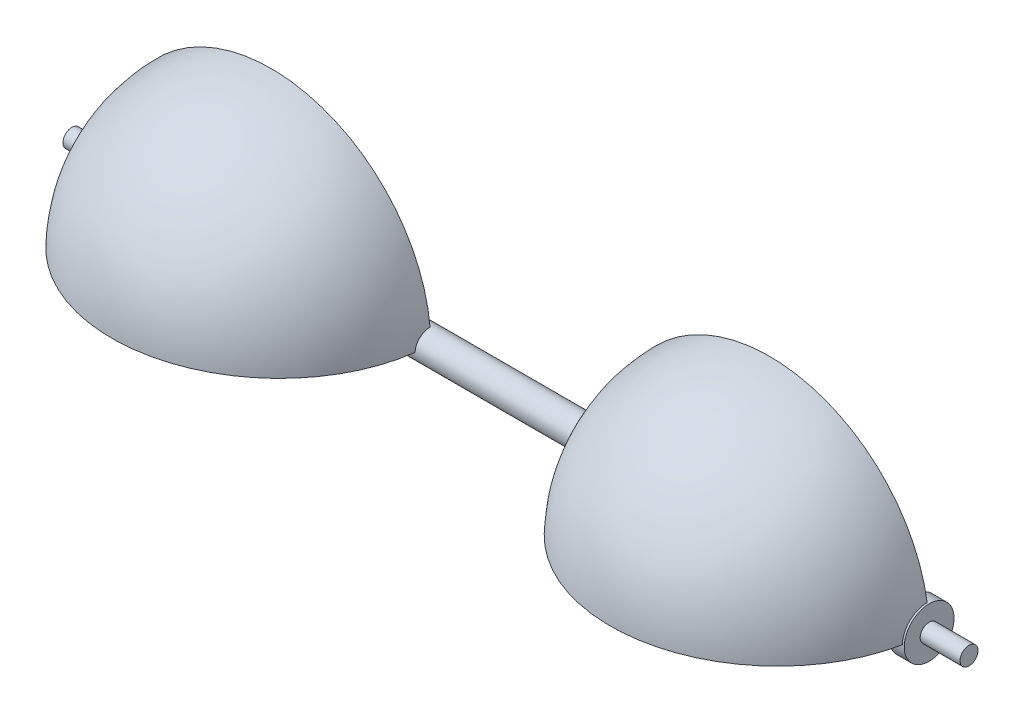
ISO-10303-21;
HEADER;
FILE_DESCRIPTION(('STEP AP214'),'2;1');
FILE_NAME('part.step','',(''),(''),'','','');
FILE_SCHEMA(('AUTOMOTIVE_DESIGN { 1 0 10303 214 1 1 1 1 }'));
ENDSEC;
DATA;
#1=APPLICATION_CONTEXT('core data for automotive mechanical design processes');
#2=APPLICATION_PROTOCOL_DEFINITION('international standard','automotive_design',2000,#1);
#3=PRODUCT_CONTEXT('',#1,'mechanical');
#4=PRODUCT('Part','Part','',(#3));
#5=PRODUCT_RELATED_PRODUCT_CATEGORY('part','',(#4));
#6=PRODUCT_DEFINITION_FORMATION('','',#4);
#7=PRODUCT_DEFINITION_CONTEXT('part definition',#1,'design');
#8=PRODUCT_DEFINITION('design','',#6,#7);
#9=PRODUCT_DEFINITION_SHAPE('','',#8);
#10=(LENGTH_UNIT() NAMED_UNIT(*) SI_UNIT(.MILLI.,.METRE.));
#11=(NAMED_UNIT(*) PLANE_ANGLE_UNIT() SI_UNIT($,.RADIAN.));
#12=(NAMED_UNIT(*) SI_UNIT($,.STERADIAN.) SOLID_ANGLE_UNIT());
#13=UNCERTAINTY_MEASURE_WITH_UNIT(LENGTH_MEASURE(1.E-05),#10,'distance_accuracy_value','');
#14=(GEOMETRIC_REPRESENTATION_CONTEXT(3) GLOBAL_UNCERTAINTY_ASSIGNED_CONTEXT((#13)) GLOBAL_UNIT_ASSIGNED_CONTEXT((#10,
#11,#12)) REPRESENTATION_CONTEXT('',''));
#15=CARTESIAN_POINT('',(0.,0.,0.));
#16=DIRECTION('',(0.,0.,1.));
#17=DIRECTION('',(1.,0.,0.));
#18=AXIS2_PLACEMENT_3D('',#15,#16,#17);
#19=CARTESIAN_POINT('',(-59.7969247492812,0.,0.));
#20=DIRECTION('',(1.,0.,0.));
#21=DIRECTION('',(0.,0.,-1.));
#22=AXIS2_PLACEMENT_3D('',#19,#20,#21);
#23=PLANE('',#22);
#24=CARTESIAN_POINT('',(-59.7969247492812,0.,0.));
#25=DIRECTION('',(1.,0.,0.));
#26=DIRECTION('',(0.,0.,-1.));
#27=AXIS2_PLACEMENT_3D('',#24,#25,#26);
#28=CIRCLE('',#27,2.5);
#29=CARTESIAN_POINT('',(-59.7969247492812,0.,-2.5));
#30=VERTEX_POINT('',#29);
#31=EDGE_CURVE('E344',#30,#30,#28,.T.);
#32=ORIENTED_EDGE('',*,*,#31,.F.);
#33=EDGE_LOOP('',(#32));
#34=FACE_BOUND('',#33,.T.);
#35=CARTESIAN_POINT('',(-59.7969247492812,0.,0.));
#36=DIRECTION('',(1.,0.,0.));
#37=DIRECTION('',(0.,0.,-1.));
#38=AXIS2_PLACEMENT_3D('',#35,#36,#37);
#39=CIRCLE('',#38,0.9);
#40=CARTESIAN_POINT('',(-59.7969247492812,0.,-0.9));
#41=VERTEX_POINT('',#40);
#42=EDGE_CURVE('E426',#41,#41,#39,.F.);
#43=ORIENTED_EDGE('',*,*,#42,.F.);
#44=EDGE_LOOP('',(#43));
#45=FACE_BOUND('',#44,.T.);
#46=ADVANCED_FACE('F33',(#34,#45),#23,.F.);
#47=CARTESIAN_POINT('',(22.2030752507188,0.,0.));
#48=DIRECTION('',(-1.,0.,0.));
#49=DIRECTION('',(0.,0.,1.));
#50=AXIS2_PLACEMENT_3D('',#47,#48,#49);
#51=PLANE('',#50);
#52=CARTESIAN_POINT('',(22.2030752507188,0.,0.));
#53=DIRECTION('',(1.,0.,0.));
#54=DIRECTION('',(0.,0.,-1.));
#55=AXIS2_PLACEMENT_3D('',#52,#53,#54);
#56=CIRCLE('',#55,2.5);
#57=CARTESIAN_POINT('',(22.2030752507188,0.,-2.5));
#58=VERTEX_POINT('',#57);
#59=EDGE_CURVE('E333',#58,#58,#56,.T.);
#60=ORIENTED_EDGE('',*,*,#59,.T.);
#61=EDGE_LOOP('',(#60));
#62=FACE_BOUND('',#61,.T.);
#63=CARTESIAN_POINT('',(22.2030752507188,0.,0.));
#64=DIRECTION('',(-1.,0.,0.));
#65=DIRECTION('',(0.,0.,1.));
#66=AXIS2_PLACEMENT_3D('',#63,#64,#65);
#67=CIRCLE('',#66,0.9);
#68=CARTESIAN_POINT('',(22.2030752507188,0.,0.9));
#69=VERTEX_POINT('',#68);
#70=EDGE_CURVE('E423',#69,#69,#67,.F.);
#71=ORIENTED_EDGE('',*,*,#70,.F.);
#72=EDGE_LOOP('',(#71));
#73=FACE_BOUND('',#72,.T.);
#74=ADVANCED_FACE('F485',(#62,#73),#51,.F.);
#75=CARTESIAN_POINT('',(6.20307525071882,0.,0.));
#76=DIRECTION('',(-1.,0.,0.));
#77=DIRECTION('',(0.,0.0348994967024975,0.999390827019096));
#78=AXIS2_PLACEMENT_3D('',#75,#76,#77);
#79=SPHERICAL_SURFACE('',#78,16.);
#80=CARTESIAN_POINT('',(22.0065558799979,0.,0.));
#81=DIRECTION('',(-1.,0.,0.));
#82=DIRECTION('',(0.,0.,1.));
#83=AXIS2_PLACEMENT_3D('',#80,#81,#82);
#84=CIRCLE('',#83,2.5);
#85=CARTESIAN_POINT('',(22.0065558799979,2.5,0.));
#86=VERTEX_POINT('',#85);
#87=CARTESIAN_POINT('',(22.0065558799979,0.0872487417562438,2.49847706754774));
#88=VERTEX_POINT('',#87);
#89=EDGE_CURVE('E338',#86,#88,#84,.F.);
#90=ORIENTED_EDGE('',*,*,#89,.F.);
#91=CARTESIAN_POINT('',(6.20307525071882,0.,0.));
#92=DIRECTION('',(0.,0.,1.));
#93=DIRECTION('',(1.,0.,0.));
#94=AXIS2_PLACEMENT_3D('',#91,#92,#93);
#95=CIRCLE('',#94,16.);
#96=CARTESIAN_POINT('',(-9.72645707135517,1.5,0.));
#97=VERTEX_POINT('',#96);
#98=EDGE_CURVE('E390',#86,#97,#95,.T.);
#99=ORIENTED_EDGE('',*,*,#98,.T.);
#100=CARTESIAN_POINT('',(-9.72645707135517,0.,0.));
#101=DIRECTION('',(1.,0.,0.));
#102=DIRECTION('',(0.,0.,-1.));
#103=AXIS2_PLACEMENT_3D('',#100,#101,#102);
#104=CIRCLE('',#103,1.5);
#105=CARTESIAN_POINT('',(-9.72645707135517,0.0523492450537463,1.49908624052864));
#106=VERTEX_POINT('',#105);
#107=EDGE_CURVE('E381',#106,#97,#104,.F.);
#108=ORIENTED_EDGE('',*,*,#107,.F.);
#109=CARTESIAN_POINT('',(6.20307525071882,0.,0.));
#110=DIRECTION('',(0.,-0.999390827019096,0.0348994967024975));
#111=DIRECTION('',(1.,0.,0.));
#112=AXIS2_PLACEMENT_3D('',#109,#110,#111);
#113=CIRCLE('',#112,16.);
#114=EDGE_CURVE('E392',#88,#106,#113,.T.);
#115=ORIENTED_EDGE('',*,*,#114,.F.);
#116=EDGE_LOOP('',(#90,#99,#108,#115));
#117=FACE_BOUND('',#116,.T.);
#118=ADVANCED_FACE('F35',(#117),#79,.T.);
#119=CARTESIAN_POINT('',(6.20307525071882,0.,0.));
#120=DIRECTION('',(0.,-0.999390827019096,0.0348994967024975));
#121=DIRECTION('',(1.,0.,0.));
#122=AXIS2_PLACEMENT_3D('',#119,#120,#121);
#123=PLANE('',#122);
#124=CARTESIAN_POINT('',(6.20307525071882,0.,0.));
#125=DIRECTION('',(0.,-0.999390827019096,0.0348994967024975));
#126=DIRECTION('',(0.,-0.0348994967024975,-0.999390827019096));
#127=AXIS2_PLACEMENT_3D('',#124,#125,#126);
#128=CIRCLE('',#127,15.);
#129=CARTESIAN_POINT('',(20.9932747084679,0.0872487417562438,2.49847706754774));
#130=VERTEX_POINT('',#129);
#131=CARTESIAN_POINT('',(-8.72173630588048,0.0523492450537463,1.49908624052864));
#132=VERTEX_POINT('',#131);
#133=EDGE_CURVE('E301',#130,#132,#128,.T.);
#134=ORIENTED_EDGE('',*,*,#133,.F.);
#135=DIRECTION('',(1.,0.,0.));
#136=VECTOR('',#135,1.);
#137=CARTESIAN_POINT('',(-8.29692474928118,0.0872487417562438,2.49847706754774));
#138=LINE('',#137,#136);
#139=EDGE_CURVE('E341',#130,#88,#138,.T.);
#140=ORIENTED_EDGE('',*,*,#139,.T.);
#141=ORIENTED_EDGE('',*,*,#114,.T.);
#142=DIRECTION('',(1.,0.,0.));
#143=VECTOR('',#142,1.);
#144=CARTESIAN_POINT('',(-8.29692474928118,0.0523492450537463,1.49908624052864));
#145=LINE('',#144,#143);
#146=EDGE_CURVE('E385',#106,#132,#145,.T.);
#147=ORIENTED_EDGE('',*,*,#146,.T.);
#148=EDGE_LOOP('',(#134,#140,#141,#147));
#149=FACE_BOUND('',#148,.T.);
#150=ADVANCED_FACE('F522',(#149),#123,.T.);
#151=CARTESIAN_POINT('',(6.20307525071882,0.,0.));
#152=DIRECTION('',(0.,0.,1.));
#153=DIRECTION('',(1.,0.,0.));
#154=AXIS2_PLACEMENT_3D('',#151,#152,#153);
#155=PLANE('',#154);
#156=DIRECTION('',(1.,0.,0.));
#157=VECTOR('',#156,1.);
#158=CARTESIAN_POINT('',(-8.29692474928118,2.5,0.));
#159=LINE('',#158,#157);
#160=CARTESIAN_POINT('',(20.9932747084679,2.5,0.));
#161=VERTEX_POINT('',#160);
#162=EDGE_CURVE('E419',#161,#86,#159,.T.);
#163=ORIENTED_EDGE('',*,*,#162,.F.);
#164=CARTESIAN_POINT('',(6.20307525071882,0.,0.));
#165=DIRECTION('',(0.,0.,1.));
#166=DIRECTION('',(1.,0.,0.));
#167=AXIS2_PLACEMENT_3D('',#164,#165,#166);
#168=CIRCLE('',#167,15.);
#169=CARTESIAN_POINT('',(-8.72173630588048,1.5,0.));
#170=VERTEX_POINT('',#169);
#171=EDGE_CURVE('E293',#161,#170,#168,.T.);
#172=ORIENTED_EDGE('',*,*,#171,.T.);
#173=DIRECTION('',(1.,0.,0.));
#174=VECTOR('',#173,1.);
#175=CARTESIAN_POINT('',(-8.29692474928118,1.5,0.));
#176=LINE('',#175,#174);
#177=EDGE_CURVE('E395',#97,#170,#176,.T.);
#178=ORIENTED_EDGE('',*,*,#177,.F.);
#179=ORIENTED_EDGE('',*,*,#98,.F.);
#180=EDGE_LOOP('',(#163,#172,#178,#179));
#181=FACE_BOUND('',#180,.T.);
#182=ADVANCED_FACE('F510',(#181),#155,.F.);
#183=CARTESIAN_POINT('',(-43.7969247492812,0.,0.));
#184=DIRECTION('',(-1.,0.,0.));
#185=DIRECTION('',(0.,0.0348994967024975,0.999390827019096));
#186=AXIS2_PLACEMENT_3D('',#183,#184,#185);
#187=SPHERICAL_SURFACE('',#186,16.);
#188=CARTESIAN_POINT('',(-59.6004053785603,0.,0.));
#189=DIRECTION('',(1.,0.,0.));
#190=DIRECTION('',(0.,0.,-1.));
#191=AXIS2_PLACEMENT_3D('',#188,#189,#190);
#192=CIRCLE('',#191,2.5);
#193=CARTESIAN_POINT('',(-59.6004053785603,0.0872487417562438,2.49847706754774));
#194=VERTEX_POINT('',#193);
#195=CARTESIAN_POINT('',(-59.6004053785603,2.5,0.));
#196=VERTEX_POINT('',#195);
#197=EDGE_CURVE('E351',#194,#196,#192,.F.);
#198=ORIENTED_EDGE('',*,*,#197,.F.);
#199=CARTESIAN_POINT('',(-43.7969247492812,0.,0.));
#200=DIRECTION('',(0.,-0.999390827019096,0.0348994967024975));
#201=DIRECTION('',(1.,0.,0.));
#202=AXIS2_PLACEMENT_3D('',#199,#200,#201);
#203=CIRCLE('',#202,16.);
#204=CARTESIAN_POINT('',(-27.8673924272072,0.0523492450537461,1.49908624052864));
#205=VERTEX_POINT('',#204);
#206=EDGE_CURVE('E364',#205,#194,#203,.T.);
#207=ORIENTED_EDGE('',*,*,#206,.F.);
#208=CARTESIAN_POINT('',(-27.8673924272072,0.,0.));
#209=DIRECTION('',(-1.,0.,0.));
#210=DIRECTION('',(0.,0.,1.));
#211=AXIS2_PLACEMENT_3D('',#208,#209,#210);
#212=CIRCLE('',#211,1.5);
#213=CARTESIAN_POINT('',(-27.8673924272072,1.5,0.));
#214=VERTEX_POINT('',#213);
#215=EDGE_CURVE('E406',#205,#214,#212,.T.);
#216=ORIENTED_EDGE('',*,*,#215,.T.);
#217=CARTESIAN_POINT('',(-43.7969247492812,0.,0.));
#218=DIRECTION('',(0.,0.,1.));
#219=DIRECTION('',(1.,0.,0.));
#220=AXIS2_PLACEMENT_3D('',#217,#218,#219);
#221=CIRCLE('',#220,16.);
#222=EDGE_CURVE('E361',#214,#196,#221,.T.);
#223=ORIENTED_EDGE('',*,*,#222,.T.);
#224=EDGE_LOOP('',(#198,#207,#216,#223));
#225=FACE_BOUND('',#224,.T.);
#226=ADVANCED_FACE('F452',(#225),#187,.T.);
#227=CARTESIAN_POINT('',(-43.7969247492812,0.,0.));
#228=DIRECTION('',(0.,-0.999390827019096,0.0348994967024975));
#229=DIRECTION('',(1.,0.,0.));
#230=AXIS2_PLACEMENT_3D('',#227,#228,#229);
#231=PLANE('',#230);
#232=CARTESIAN_POINT('',(-43.7969247492812,0.,0.));
#233=DIRECTION('',(0.,-0.999390827019096,0.0348994967024975));
#234=DIRECTION('',(0.,-0.0348994967024975,-0.999390827019096));
#235=AXIS2_PLACEMENT_3D('',#232,#233,#234);
#236=CIRCLE('',#235,15.);
#237=CARTESIAN_POINT('',(-28.8721131926819,0.0523492450537463,1.49908624052864));
#238=VERTEX_POINT('',#237);
#239=CARTESIAN_POINT('',(-58.5871242070302,0.0872487417562439,2.49847706754774));
#240=VERTEX_POINT('',#239);
#241=EDGE_CURVE('E315',#238,#240,#236,.T.);
#242=ORIENTED_EDGE('',*,*,#241,.F.);
#243=DIRECTION('',(1.,0.,0.));
#244=VECTOR('',#243,1.);
#245=CARTESIAN_POINT('',(-8.29692474928118,0.0523492450537463,1.49908624052864));
#246=LINE('',#245,#244);
#247=EDGE_CURVE('E372',#205,#238,#246,.F.);
#248=ORIENTED_EDGE('',*,*,#247,.F.);
#249=ORIENTED_EDGE('',*,*,#206,.T.);
#250=DIRECTION('',(1.,0.,0.));
#251=VECTOR('',#250,1.);
#252=CARTESIAN_POINT('',(-8.29692474928118,0.0872487417562438,2.49847706754774));
#253=LINE('',#252,#251);
#254=EDGE_CURVE('E355',#194,#240,#253,.T.);
#255=ORIENTED_EDGE('',*,*,#254,.T.);
#256=EDGE_LOOP('',(#242,#248,#249,#255));
#257=FACE_BOUND('',#256,.T.);
#258=ADVANCED_FACE('F448',(#257),#231,.T.);
#259=CARTESIAN_POINT('',(-43.7969247492812,0.,0.));
#260=DIRECTION('',(0.,0.,1.));
#261=DIRECTION('',(1.,0.,0.));
#262=AXIS2_PLACEMENT_3D('',#259,#260,#261);
#263=PLANE('',#262);
#264=DIRECTION('',(1.,0.,0.));
#265=VECTOR('',#264,1.);
#266=CARTESIAN_POINT('',(-8.29692474928118,1.5,0.));
#267=LINE('',#266,#265);
#268=CARTESIAN_POINT('',(-28.8721131926819,1.5,0.));
#269=VERTEX_POINT('',#268);
#270=EDGE_CURVE('E368',#214,#269,#267,.F.);
#271=ORIENTED_EDGE('',*,*,#270,.T.);
#272=CARTESIAN_POINT('',(-43.7969247492812,0.,0.));
#273=DIRECTION('',(0.,0.,1.));
#274=DIRECTION('',(1.,0.,0.));
#275=AXIS2_PLACEMENT_3D('',#272,#273,#274);
#276=CIRCLE('',#275,15.);
#277=CARTESIAN_POINT('',(-58.5871242070302,2.5,0.));
#278=VERTEX_POINT('',#277);
#279=EDGE_CURVE('E319',#269,#278,#276,.T.);
#280=ORIENTED_EDGE('',*,*,#279,.T.);
#281=DIRECTION('',(1.,0.,0.));
#282=VECTOR('',#281,1.);
#283=CARTESIAN_POINT('',(-8.29692474928118,2.5,0.));
#284=LINE('',#283,#282);
#285=EDGE_CURVE('E410',#196,#278,#284,.T.);
#286=ORIENTED_EDGE('',*,*,#285,.F.);
#287=ORIENTED_EDGE('',*,*,#222,.F.);
#288=EDGE_LOOP('',(#271,#280,#286,#287));
#289=FACE_BOUND('',#288,.T.);
#290=ADVANCED_FACE('F458',(#289),#263,.F.);
#291=CARTESIAN_POINT('',(-8.29692474928118,0.,0.));
#292=DIRECTION('',(-1.,0.,0.));
#293=DIRECTION('',(0.,0.,1.));
#294=AXIS2_PLACEMENT_3D('',#291,#292,#293);
#295=PLANE('',#294);
#296=DIRECTION('',(0.,-0.0348994967024975,-0.999390827019096));
#297=VECTOR('',#296,1.);
#298=CARTESIAN_POINT('',(-8.29692474928118,0.,0.));
#299=LINE('',#298,#297);
#300=CARTESIAN_POINT('',(-8.29692474928118,0.0523492450537463,1.49908624052864));
#301=VERTEX_POINT('',#300);
#302=CARTESIAN_POINT('',(-8.29692474928118,0.,0.));
#303=VERTEX_POINT('',#302);
#304=EDGE_CURVE('E388',#301,#303,#299,.T.);
#305=ORIENTED_EDGE('',*,*,#304,.F.);
#306=CARTESIAN_POINT('',(-8.29692474928118,0.,0.));
#307=DIRECTION('',(1.,0.,0.));
#308=DIRECTION('',(0.,0.,-1.));
#309=AXIS2_PLACEMENT_3D('',#306,#307,#308);
#310=CIRCLE('',#309,1.5);
#311=CARTESIAN_POINT('',(-8.29692474928118,1.5,0.));
#312=VERTEX_POINT('',#311);
#313=EDGE_CURVE('E378',#301,#312,#310,.T.);
#314=ORIENTED_EDGE('',*,*,#313,.T.);
#315=DIRECTION('',(0.,-1.,0.));
#316=VECTOR('',#315,1.);
#317=CARTESIAN_POINT('',(-8.29692474928118,0.,0.));
#318=LINE('',#317,#316);
#319=EDGE_CURVE('E398',#312,#303,#318,.T.);
#320=ORIENTED_EDGE('',*,*,#319,.T.);
#321=EDGE_LOOP('',(#305,#314,#320));
#322=FACE_BOUND('',#321,.T.);
#323=ADVANCED_FACE('F505',(#322),#295,.F.);
#324=CARTESIAN_POINT('',(-8.29692474928118,0.,0.));
#325=DIRECTION('',(1.,0.,0.));
#326=DIRECTION('',(0.,0.,-1.));
#327=AXIS2_PLACEMENT_3D('',#324,#325,#326);
#328=CYLINDRICAL_SURFACE('',#327,1.5);
#329=ORIENTED_EDGE('',*,*,#146,.F.);
#330=ORIENTED_EDGE('',*,*,#107,.T.);
#331=ORIENTED_EDGE('',*,*,#177,.T.);
#332=EDGE_CURVE('E394',#170,#312,#176,.T.);
#333=ORIENTED_EDGE('',*,*,#332,.T.);
#334=ORIENTED_EDGE('',*,*,#313,.F.);
#335=EDGE_CURVE('E384',#132,#301,#145,.T.);
#336=ORIENTED_EDGE('',*,*,#335,.F.);
#337=EDGE_LOOP('',(#329,#330,#331,#333,#334,#336));
#338=FACE_BOUND('',#337,.T.);
#339=ORIENTED_EDGE('',*,*,#215,.F.);
#340=ORIENTED_EDGE('',*,*,#247,.T.);
#341=CARTESIAN_POINT('',(-29.2969247492812,0.0523492450537463,1.49908624052864));
#342=VERTEX_POINT('',#341);
#343=EDGE_CURVE('E371',#238,#342,#246,.F.);
#344=ORIENTED_EDGE('',*,*,#343,.T.);
#345=CARTESIAN_POINT('',(-29.2969247492812,0.,0.));
#346=DIRECTION('',(1.,0.,0.));
#347=DIRECTION('',(0.,0.,-1.));
#348=AXIS2_PLACEMENT_3D('',#345,#346,#347);
#349=CIRCLE('',#348,1.5);
#350=CARTESIAN_POINT('',(-29.2969247492812,1.5,0.));
#351=VERTEX_POINT('',#350);
#352=EDGE_CURVE('E375',#342,#351,#349,.T.);
#353=ORIENTED_EDGE('',*,*,#352,.T.);
#354=EDGE_CURVE('E367',#269,#351,#267,.F.);
#355=ORIENTED_EDGE('',*,*,#354,.F.);
#356=ORIENTED_EDGE('',*,*,#270,.F.);
#357=EDGE_LOOP('',(#339,#340,#344,#353,#355,#356));
#358=FACE_BOUND('',#357,.T.);
#359=ADVANCED_FACE('F513',(#338,#358),#328,.T.);
#360=CARTESIAN_POINT('',(-29.2969247492812,0.,0.));
#361=DIRECTION('',(1.,0.,0.));
#362=DIRECTION('',(0.,0.,-1.));
#363=AXIS2_PLACEMENT_3D('',#360,#361,#362);
#364=PLANE('',#363);
#365=ORIENTED_EDGE('',*,*,#352,.F.);
#366=DIRECTION('',(0.,-0.0348994967024975,-0.999390827019096));
#367=VECTOR('',#366,1.);
#368=CARTESIAN_POINT('',(-29.2969247492812,0.,0.));
#369=LINE('',#368,#367);
#370=CARTESIAN_POINT('',(-29.2969247492812,0.,0.));
#371=VERTEX_POINT('',#370);
#372=EDGE_CURVE('E403',#342,#371,#369,.T.);
#373=ORIENTED_EDGE('',*,*,#372,.T.);
#374=DIRECTION('',(0.,-1.,0.));
#375=VECTOR('',#374,1.);
#376=CARTESIAN_POINT('',(-29.2969247492812,0.,0.));
#377=LINE('',#376,#375);
#378=EDGE_CURVE('E401',#351,#371,#377,.T.);
#379=ORIENTED_EDGE('',*,*,#378,.F.);
#380=EDGE_LOOP('',(#365,#373,#379));
#381=FACE_BOUND('',#380,.T.);
#382=ADVANCED_FACE('F502',(#381),#364,.F.);
#383=CARTESIAN_POINT('',(-58.2969247492812,0.,0.));
#384=DIRECTION('',(-1.,0.,0.));
#385=DIRECTION('',(0.,0.,1.));
#386=AXIS2_PLACEMENT_3D('',#383,#384,#385);
#387=PLANE('',#386);
#388=CARTESIAN_POINT('',(-58.2969247492812,0.,0.));
#389=DIRECTION('',(1.,0.,0.));
#390=DIRECTION('',(0.,0.,-1.));
#391=AXIS2_PLACEMENT_3D('',#388,#389,#390);
#392=CIRCLE('',#391,2.);
#393=CARTESIAN_POINT('',(-58.2969247492812,2.,0.));
#394=VERTEX_POINT('',#393);
#395=CARTESIAN_POINT('',(-58.2969247492812,0.0697989934049951,1.99878165403819));
#396=VERTEX_POINT('',#395);
#397=EDGE_CURVE('E238',#394,#396,#392,.T.);
#398=ORIENTED_EDGE('',*,*,#397,.T.);
#399=DIRECTION('',(0.,-0.0348994967024975,-0.999390827019096));
#400=VECTOR('',#399,1.);
#401=CARTESIAN_POINT('',(-58.2969247492812,0.,0.));
#402=LINE('',#401,#400);
#403=CARTESIAN_POINT('',(-58.2969247492812,0.0872487417562438,2.49847706754774));
#404=VERTEX_POINT('',#403);
#405=EDGE_CURVE('E358',#404,#396,#402,.T.);
#406=ORIENTED_EDGE('',*,*,#405,.F.);
#407=CARTESIAN_POINT('',(-58.2969247492812,0.,0.));
#408=DIRECTION('',(1.,0.,0.));
#409=DIRECTION('',(0.,0.,-1.));
#410=AXIS2_PLACEMENT_3D('',#407,#408,#409);
#411=CIRCLE('',#410,2.5);
#412=CARTESIAN_POINT('',(-58.2969247492812,-1.5,2.));
#413=VERTEX_POINT('',#412);
#414=EDGE_CURVE('E348',#404,#413,#411,.T.);
#415=ORIENTED_EDGE('',*,*,#414,.T.);
#416=DIRECTION('',(0.,-1.,0.));
#417=VECTOR('',#416,1.);
#418=CARTESIAN_POINT('',(-58.2969247492812,0.,2.));
#419=LINE('',#418,#417);
#420=CARTESIAN_POINT('',(-58.2969247492812,-9.,2.));
#421=VERTEX_POINT('',#420);
#422=EDGE_CURVE('E241',#413,#421,#419,.T.);
#423=ORIENTED_EDGE('',*,*,#422,.T.);
#424=CARTESIAN_POINT('',(-58.2969247492812,-9.,0.));
#425=DIRECTION('',(1.,0.,0.));
#426=DIRECTION('',(0.,0.,-1.));
#427=AXIS2_PLACEMENT_3D('',#424,#425,#426);
#428=CIRCLE('',#427,2.);
#429=CARTESIAN_POINT('',(-58.2969247492812,-9.,-2.));
#430=VERTEX_POINT('',#429);
#431=EDGE_CURVE('E228',#421,#430,#428,.T.);
#432=ORIENTED_EDGE('',*,*,#431,.T.);
#433=DIRECTION('',(0.,1.,0.));
#434=VECTOR('',#433,1.);
#435=CARTESIAN_POINT('',(-58.2969247492812,0.,-2.));
#436=LINE('',#435,#434);
#437=CARTESIAN_POINT('',(-58.2969247492812,-1.5,-2.));
#438=VERTEX_POINT('',#437);
#439=EDGE_CURVE('E48',#430,#438,#436,.T.);
#440=ORIENTED_EDGE('',*,*,#439,.T.);
#441=CARTESIAN_POINT('',(-58.2969247492812,2.5,0.));
#442=VERTEX_POINT('',#441);
#443=EDGE_CURVE('E347',#438,#442,#411,.T.);
#444=ORIENTED_EDGE('',*,*,#443,.T.);
#445=DIRECTION('',(0.,-1.,0.));
#446=VECTOR('',#445,1.);
#447=CARTESIAN_POINT('',(-58.2969247492812,0.,0.));
#448=LINE('',#447,#446);
#449=EDGE_CURVE('E413',#442,#394,#448,.T.);
#450=ORIENTED_EDGE('',*,*,#449,.T.);
#451=EDGE_LOOP('',(#398,#406,#415,#423,#432,#440,#444,#450));
#452=FACE_BOUND('',#451,.T.);
#453=CARTESIAN_POINT('',(-58.2969247492812,-9.,0.));
#454=DIRECTION('',(1.,0.,0.));
#455=DIRECTION('',(0.,0.,-1.));
#456=AXIS2_PLACEMENT_3D('',#453,#454,#455);
#457=CIRCLE('',#456,0.75);
#458=CARTESIAN_POINT('',(-58.2969247492812,-9.,-0.750000000000002));
#459=VERTEX_POINT('',#458);
#460=EDGE_CURVE('E813',#459,#459,#457,.T.);
#461=ORIENTED_EDGE('',*,*,#460,.F.);
#462=EDGE_LOOP('',(#461));
#463=FACE_BOUND('',#462,.T.);
#464=ADVANCED_FACE('F439',(#452,#463),#387,.F.);
#465=CARTESIAN_POINT('',(-8.29692474928118,0.,0.));
#466=DIRECTION('',(1.,0.,0.));
#467=DIRECTION('',(0.,0.,-1.));
#468=AXIS2_PLACEMENT_3D('',#465,#466,#467);
#469=CYLINDRICAL_SURFACE('',#468,2.5);
#470=ORIENTED_EDGE('',*,*,#443,.F.);
#471=DIRECTION('',(1.,0.,0.));
#472=VECTOR('',#471,1.);
#473=CARTESIAN_POINT('',(-8.29692474928118,-1.5,-2.));
#474=LINE('',#473,#472);
#475=CARTESIAN_POINT('',(-59.2969247492812,-1.5,-2.));
#476=VERTEX_POINT('',#475);
#477=EDGE_CURVE('E11',#438,#476,#474,.F.);
#478=ORIENTED_EDGE('',*,*,#477,.T.);
#479=CARTESIAN_POINT('',(-59.2969247492812,0.,0.));
#480=DIRECTION('',(1.,0.,0.));
#481=DIRECTION('',(0.,0.,-1.));
#482=AXIS2_PLACEMENT_3D('',#479,#480,#481);
#483=CIRCLE('',#482,2.5);
#484=CARTESIAN_POINT('',(-59.2969247492812,-1.5,2.));
#485=VERTEX_POINT('',#484);
#486=EDGE_CURVE('E431',#485,#476,#483,.T.);
#487=ORIENTED_EDGE('',*,*,#486,.F.);
#488=DIRECTION('',(1.,0.,0.));
#489=VECTOR('',#488,1.);
#490=CARTESIAN_POINT('',(-8.29692474928118,-1.5,2.));
#491=LINE('',#490,#489);
#492=EDGE_CURVE('E41',#485,#413,#491,.T.);
#493=ORIENTED_EDGE('',*,*,#492,.T.);
#494=ORIENTED_EDGE('',*,*,#414,.F.);
#495=EDGE_CURVE('E354',#240,#404,#253,.T.);
#496=ORIENTED_EDGE('',*,*,#495,.F.);
#497=ORIENTED_EDGE('',*,*,#254,.F.);
#498=ORIENTED_EDGE('',*,*,#197,.T.);
#499=ORIENTED_EDGE('',*,*,#285,.T.);
#500=EDGE_CURVE('E409',#278,#442,#284,.T.);
#501=ORIENTED_EDGE('',*,*,#500,.T.);
#502=EDGE_LOOP('',(#470,#478,#487,#493,#494,#496,#497,#498,#499,#501));
#503=FACE_BOUND('',#502,.T.);
#504=ORIENTED_EDGE('',*,*,#31,.T.);
#505=EDGE_LOOP('',(#504));
#506=FACE_BOUND('',#505,.T.);
#507=ADVANCED_FACE('F435',(#503,#506),#469,.T.);
#508=CARTESIAN_POINT('',(-8.29692474928118,0.,0.));
#509=DIRECTION('',(1.,0.,0.));
#510=DIRECTION('',(0.,0.,-1.));
#511=AXIS2_PLACEMENT_3D('',#508,#509,#510);
#512=CYLINDRICAL_SURFACE('',#511,2.5);
#513=CARTESIAN_POINT('',(20.7030752507188,0.0872487417562438,2.49847706754774));
#514=VERTEX_POINT('',#513);
#515=EDGE_CURVE('E342',#514,#130,#138,.T.);
#516=ORIENTED_EDGE('',*,*,#515,.F.);
#517=CARTESIAN_POINT('',(20.7030752507188,0.,0.));
#518=DIRECTION('',(1.,0.,0.));
#519=DIRECTION('',(0.,0.,-1.));
#520=AXIS2_PLACEMENT_3D('',#517,#518,#519);
#521=CIRCLE('',#520,2.5);
#522=CARTESIAN_POINT('',(20.7030752507188,2.5,0.));
#523=VERTEX_POINT('',#522);
#524=EDGE_CURVE('E330',#514,#523,#521,.T.);
#525=ORIENTED_EDGE('',*,*,#524,.T.);
#526=EDGE_CURVE('E420',#523,#161,#159,.T.);
#527=ORIENTED_EDGE('',*,*,#526,.T.);
#528=ORIENTED_EDGE('',*,*,#162,.T.);
#529=ORIENTED_EDGE('',*,*,#89,.T.);
#530=ORIENTED_EDGE('',*,*,#139,.F.);
#531=EDGE_LOOP('',(#516,#525,#527,#528,#529,#530));
#532=FACE_BOUND('',#531,.T.);
#533=ORIENTED_EDGE('',*,*,#59,.F.);
#534=EDGE_LOOP('',(#533));
#535=FACE_BOUND('',#534,.T.);
#536=ADVANCED_FACE('F499',(#532,#535),#512,.T.);
#537=CARTESIAN_POINT('',(20.7030752507188,0.,0.));
#538=DIRECTION('',(1.,0.,0.));
#539=DIRECTION('',(0.,0.,-1.));
#540=AXIS2_PLACEMENT_3D('',#537,#538,#539);
#541=PLANE('',#540);
#542=DIRECTION('',(0.,0.0348994967024975,0.999390827019096));
#543=VECTOR('',#542,1.);
#544=CARTESIAN_POINT('',(20.7030752507188,0.,0.));
#545=LINE('',#544,#543);
#546=CARTESIAN_POINT('',(20.7030752507188,0.,0.));
#547=VERTEX_POINT('',#546);
#548=EDGE_CURVE('E336',#547,#514,#545,.T.);
#549=ORIENTED_EDGE('',*,*,#548,.F.);
#550=DIRECTION('',(0.,1.,0.));
#551=VECTOR('',#550,1.);
#552=CARTESIAN_POINT('',(20.7030752507188,0.,0.));
#553=LINE('',#552,#551);
#554=EDGE_CURVE('E416',#547,#523,#553,.T.);
#555=ORIENTED_EDGE('',*,*,#554,.T.);
#556=ORIENTED_EDGE('',*,*,#524,.F.);
#557=EDGE_LOOP('',(#549,#555,#556));
#558=FACE_BOUND('',#557,.T.);
#559=ADVANCED_FACE('F601',(#558),#541,.F.);
#560=CARTESIAN_POINT('',(6.20307525071882,0.,0.));
#561=DIRECTION('',(0.,-0.999390827019096,0.0348994967024975));
#562=DIRECTION('',(1.,0.,0.));
#563=AXIS2_PLACEMENT_3D('',#560,#561,#562);
#564=PLANE('',#563);
#565=ORIENTED_EDGE('',*,*,#548,.T.);
#566=ORIENTED_EDGE('',*,*,#515,.T.);
#567=CARTESIAN_POINT('',(21.1278868073181,0.0523492450537463,1.49908624052864));
#568=VERTEX_POINT('',#567);
#569=EDGE_CURVE('E298',#568,#130,#128,.T.);
#570=ORIENTED_EDGE('',*,*,#569,.F.);
#571=DIRECTION('',(1.,0.,0.));
#572=VECTOR('',#571,1.);
#573=CARTESIAN_POINT('',(21.7030752507188,0.0523492450537463,1.49908624052864));
#574=LINE('',#573,#572);
#575=CARTESIAN_POINT('',(21.2030752507188,0.0523492450537463,1.49908624052864));
#576=VERTEX_POINT('',#575);
#577=EDGE_CURVE('E271',#576,#568,#574,.F.);
#578=ORIENTED_EDGE('',*,*,#577,.F.);
#579=DIRECTION('',(0.,0.0348994967024975,0.999390827019096));
#580=VECTOR('',#579,1.);
#581=CARTESIAN_POINT('',(21.2030752507188,0.,0.));
#582=LINE('',#581,#580);
#583=CARTESIAN_POINT('',(21.2030752507188,0.,0.));
#584=VERTEX_POINT('',#583);
#585=EDGE_CURVE('E295',#584,#576,#582,.T.);
#586=ORIENTED_EDGE('',*,*,#585,.F.);
#587=DIRECTION('',(1.,0.,0.));
#588=VECTOR('',#587,1.);
#589=CARTESIAN_POINT('',(-9.79692474928118,0.,0.));
#590=LINE('',#589,#588);
#591=EDGE_CURVE('E267',#547,#584,#590,.T.);
#592=ORIENTED_EDGE('',*,*,#591,.F.);
#593=EDGE_LOOP('',(#565,#566,#570,#578,#586,#592));
#594=FACE_BOUND('',#593,.T.);
#595=ADVANCED_FACE('F576',(#594),#564,.F.);
#596=CARTESIAN_POINT('',(6.20307525071882,0.,0.));
#597=DIRECTION('',(0.,0.,1.));
#598=DIRECTION('',(1.,0.,0.));
#599=AXIS2_PLACEMENT_3D('',#596,#597,#598);
#600=PLANE('',#599);
#601=ORIENTED_EDGE('',*,*,#554,.F.);
#602=ORIENTED_EDGE('',*,*,#591,.T.);
#603=DIRECTION('',(0.,-1.,0.));
#604=VECTOR('',#603,1.);
#605=CARTESIAN_POINT('',(21.2030752507188,0.,0.));
#606=LINE('',#605,#604);
#607=CARTESIAN_POINT('',(21.2030752507188,1.5,0.));
#608=VERTEX_POINT('',#607);
#609=EDGE_CURVE('E327',#608,#584,#606,.T.);
#610=ORIENTED_EDGE('',*,*,#609,.F.);
#611=DIRECTION('',(1.,0.,0.));
#612=VECTOR('',#611,1.);
#613=CARTESIAN_POINT('',(21.7030752507188,1.5,0.));
#614=LINE('',#613,#612);
#615=CARTESIAN_POINT('',(21.1278868073181,1.5,0.));
#616=VERTEX_POINT('',#615);
#617=EDGE_CURVE('E282',#608,#616,#614,.F.);
#618=ORIENTED_EDGE('',*,*,#617,.T.);
#619=EDGE_CURVE('E289',#616,#161,#168,.T.);
#620=ORIENTED_EDGE('',*,*,#619,.T.);
#621=ORIENTED_EDGE('',*,*,#526,.F.);
#622=EDGE_LOOP('',(#601,#602,#610,#618,#620,#621));
#623=FACE_BOUND('',#622,.T.);
#624=ADVANCED_FACE('F620',(#623),#600,.T.);
#625=CARTESIAN_POINT('',(-43.7969247492812,0.,0.));
#626=DIRECTION('',(0.,-0.999390827019096,0.0348994967024975));
#627=DIRECTION('',(1.,0.,0.));
#628=AXIS2_PLACEMENT_3D('',#625,#626,#627);
#629=PLANE('',#628);
#630=ORIENTED_EDGE('',*,*,#343,.F.);
#631=CARTESIAN_POINT('',(-28.8052603987162,0.0174497483512488,0.499695413509548));
#632=VERTEX_POINT('',#631);
#633=EDGE_CURVE('E262',#632,#238,#236,.T.);
#634=ORIENTED_EDGE('',*,*,#633,.F.);
#635=DIRECTION('',(1.,0.,0.));
#636=VECTOR('',#635,1.);
#637=CARTESIAN_POINT('',(-28.8052603987162,0.0174497483512488,0.499695413509548));
#638=LINE('',#637,#636);
#639=CARTESIAN_POINT('',(-28.2969247492812,0.0174497483512488,0.499695413509548));
#640=VERTEX_POINT('',#639);
#641=EDGE_CURVE('E286',#632,#640,#638,.T.);
#642=ORIENTED_EDGE('',*,*,#641,.T.);
#643=DIRECTION('',(0.,-0.0348994967024975,-0.999390827019096));
#644=VECTOR('',#643,1.);
#645=CARTESIAN_POINT('',(-28.2969247492812,0.,0.));
#646=LINE('',#645,#644);
#647=CARTESIAN_POINT('',(-28.2969247492812,0.,0.));
#648=VERTEX_POINT('',#647);
#649=EDGE_CURVE('E283',#640,#648,#646,.T.);
#650=ORIENTED_EDGE('',*,*,#649,.T.);
#651=DIRECTION('',(1.,0.,0.));
#652=VECTOR('',#651,1.);
#653=CARTESIAN_POINT('',(-59.7969247492812,0.,0.));
#654=LINE('',#653,#652);
#655=EDGE_CURVE('E259',#371,#648,#654,.T.);
#656=ORIENTED_EDGE('',*,*,#655,.F.);
#657=ORIENTED_EDGE('',*,*,#372,.F.);
#658=EDGE_LOOP('',(#630,#634,#642,#650,#656,#657));
#659=FACE_BOUND('',#658,.T.);
#660=ADVANCED_FACE('F577',(#659),#629,.F.);
#661=CARTESIAN_POINT('',(-43.7969247492812,0.,0.));
#662=DIRECTION('',(0.,0.,1.));
#663=DIRECTION('',(1.,0.,0.));
#664=AXIS2_PLACEMENT_3D('',#661,#662,#663);
#665=PLANE('',#664);
#666=ORIENTED_EDGE('',*,*,#354,.T.);
#667=ORIENTED_EDGE('',*,*,#378,.T.);
#668=ORIENTED_EDGE('',*,*,#655,.T.);
#669=DIRECTION('',(0.,-1.,0.));
#670=VECTOR('',#669,1.);
#671=CARTESIAN_POINT('',(-28.2969247492812,0.,0.));
#672=LINE('',#671,#670);
#673=CARTESIAN_POINT('',(-28.2969247492812,0.5,0.));
#674=VERTEX_POINT('',#673);
#675=EDGE_CURVE('E308',#674,#648,#672,.T.);
#676=ORIENTED_EDGE('',*,*,#675,.F.);
#677=DIRECTION('',(1.,0.,0.));
#678=VECTOR('',#677,1.);
#679=CARTESIAN_POINT('',(-28.8052603987162,0.5,0.));
#680=LINE('',#679,#678);
#681=CARTESIAN_POINT('',(-28.8052603987162,0.5,0.));
#682=VERTEX_POINT('',#681);
#683=EDGE_CURVE('E261',#682,#674,#680,.T.);
#684=ORIENTED_EDGE('',*,*,#683,.F.);
#685=EDGE_CURVE('E316',#682,#269,#276,.T.);
#686=ORIENTED_EDGE('',*,*,#685,.T.);
#687=EDGE_LOOP('',(#666,#667,#668,#676,#684,#686));
#688=FACE_BOUND('',#687,.T.);
#689=ADVANCED_FACE('F569',(#688),#665,.T.);
#690=CARTESIAN_POINT('',(6.20307525071882,0.,0.));
#691=DIRECTION('',(-1.,0.,0.));
#692=DIRECTION('',(0.,0.0348994967024975,0.999390827019096));
#693=AXIS2_PLACEMENT_3D('',#690,#691,#692);
#694=SPHERICAL_SURFACE('',#693,15.);
#695=CARTESIAN_POINT('',(21.1278868073181,0.,0.));
#696=DIRECTION('',(1.,0.,0.));
#697=DIRECTION('',(0.,0.,-1.));
#698=AXIS2_PLACEMENT_3D('',#695,#696,#697);
#699=CIRCLE('',#698,1.5);
#700=EDGE_CURVE('E268',#616,#568,#699,.T.);
#701=ORIENTED_EDGE('',*,*,#700,.T.);
#702=ORIENTED_EDGE('',*,*,#569,.T.);
#703=ORIENTED_EDGE('',*,*,#133,.T.);
#704=CARTESIAN_POINT('',(-8.78858909984613,0.0174497483512488,0.499695413509548));
#705=VERTEX_POINT('',#704);
#706=EDGE_CURVE('E292',#132,#705,#128,.T.);
#707=ORIENTED_EDGE('',*,*,#706,.T.);
#708=CARTESIAN_POINT('',(-8.78858909984613,0.,0.));
#709=DIRECTION('',(1.,0.,0.));
#710=DIRECTION('',(0.,0.,-1.));
#711=AXIS2_PLACEMENT_3D('',#708,#709,#710);
#712=CIRCLE('',#711,0.5);
#713=CARTESIAN_POINT('',(-8.78858909984613,0.5,0.));
#714=VERTEX_POINT('',#713);
#715=EDGE_CURVE('E272',#705,#714,#712,.F.);
#716=ORIENTED_EDGE('',*,*,#715,.T.);
#717=EDGE_CURVE('E56',#170,#714,#168,.T.);
#718=ORIENTED_EDGE('',*,*,#717,.F.);
#719=ORIENTED_EDGE('',*,*,#171,.F.);
#720=ORIENTED_EDGE('',*,*,#619,.F.);
#721=EDGE_LOOP('',(#701,#702,#703,#707,#716,#718,#719,#720));
#722=FACE_BOUND('',#721,.T.);
#723=ADVANCED_FACE('F565',(#722),#694,.F.);
#724=ORIENTED_EDGE('',*,*,#335,.T.);
#725=ORIENTED_EDGE('',*,*,#304,.T.);
#726=CARTESIAN_POINT('',(-9.29692474928118,0.,0.));
#727=VERTEX_POINT('',#726);
#728=EDGE_CURVE('E263',#727,#303,#590,.T.);
#729=ORIENTED_EDGE('',*,*,#728,.F.);
#730=DIRECTION('',(0.,-0.0348994967024975,-0.999390827019096));
#731=VECTOR('',#730,1.);
#732=CARTESIAN_POINT('',(-9.29692474928118,0.,0.));
#733=LINE('',#732,#731);
#734=CARTESIAN_POINT('',(-9.29692474928118,0.0174497483512488,0.499695413509548));
#735=VERTEX_POINT('',#734);
#736=EDGE_CURVE('E303',#735,#727,#733,.T.);
#737=ORIENTED_EDGE('',*,*,#736,.F.);
#738=DIRECTION('',(1.,0.,0.));
#739=VECTOR('',#738,1.);
#740=CARTESIAN_POINT('',(-8.78858909984613,0.0174497483512488,0.499695413509548));
#741=LINE('',#740,#739);
#742=EDGE_CURVE('E274',#705,#735,#741,.F.);
#743=ORIENTED_EDGE('',*,*,#742,.F.);
#744=ORIENTED_EDGE('',*,*,#706,.F.);
#745=EDGE_LOOP('',(#724,#725,#729,#737,#743,#744));
#746=FACE_BOUND('',#745,.T.);
#747=ADVANCED_FACE('F551',(#746),#564,.F.);
#748=ORIENTED_EDGE('',*,*,#332,.F.);
#749=ORIENTED_EDGE('',*,*,#717,.T.);
#750=DIRECTION('',(1.,0.,0.));
#751=VECTOR('',#750,1.);
#752=CARTESIAN_POINT('',(-8.78858909984613,0.5,0.));
#753=LINE('',#752,#751);
#754=CARTESIAN_POINT('',(-9.29692474928118,0.5,0.));
#755=VERTEX_POINT('',#754);
#756=EDGE_CURVE('E266',#714,#755,#753,.F.);
#757=ORIENTED_EDGE('',*,*,#756,.T.);
#758=DIRECTION('',(0.,-1.,0.));
#759=VECTOR('',#758,1.);
#760=CARTESIAN_POINT('',(-9.29692474928118,0.,0.));
#761=LINE('',#760,#759);
#762=EDGE_CURVE('E305',#755,#727,#761,.T.);
#763=ORIENTED_EDGE('',*,*,#762,.T.);
#764=ORIENTED_EDGE('',*,*,#728,.T.);
#765=ORIENTED_EDGE('',*,*,#319,.F.);
#766=EDGE_LOOP('',(#748,#749,#757,#763,#764,#765));
#767=FACE_BOUND('',#766,.T.);
#768=ADVANCED_FACE('F555',(#767),#600,.T.);
#769=CARTESIAN_POINT('',(-43.7969247492812,0.,0.));
#770=DIRECTION('',(-1.,0.,0.));
#771=DIRECTION('',(0.,0.0348994967024975,0.999390827019096));
#772=AXIS2_PLACEMENT_3D('',#769,#770,#771);
#773=SPHERICAL_SURFACE('',#772,15.);
#774=CARTESIAN_POINT('',(-58.6629934965997,0.,0.));
#775=DIRECTION('',(1.,0.,0.));
#776=DIRECTION('',(0.,0.,-1.));
#777=AXIS2_PLACEMENT_3D('',#774,#775,#776);
#778=CIRCLE('',#777,2.);
#779=CARTESIAN_POINT('',(-58.6629934965997,2.,0.));
#780=VERTEX_POINT('',#779);
#781=CARTESIAN_POINT('',(-58.6629934965997,0.0697989934049947,1.99878165403818));
#782=VERTEX_POINT('',#781);
#783=EDGE_CURVE('E246',#780,#782,#778,.T.);
#784=ORIENTED_EDGE('',*,*,#783,.F.);
#785=EDGE_CURVE('E297',#278,#780,#276,.T.);
#786=ORIENTED_EDGE('',*,*,#785,.F.);
#787=ORIENTED_EDGE('',*,*,#279,.F.);
#788=ORIENTED_EDGE('',*,*,#685,.F.);
#789=CARTESIAN_POINT('',(-28.8052603987162,0.,0.));
#790=DIRECTION('',(1.,0.,0.));
#791=DIRECTION('',(0.,0.,-1.));
#792=AXIS2_PLACEMENT_3D('',#789,#790,#791);
#793=CIRCLE('',#792,0.5);
#794=EDGE_CURVE('E279',#632,#682,#793,.F.);
#795=ORIENTED_EDGE('',*,*,#794,.F.);
#796=ORIENTED_EDGE('',*,*,#633,.T.);
#797=ORIENTED_EDGE('',*,*,#241,.T.);
#798=EDGE_CURVE('E314',#240,#782,#236,.T.);
#799=ORIENTED_EDGE('',*,*,#798,.T.);
#800=EDGE_LOOP('',(#784,#786,#787,#788,#795,#796,#797,#799));
#801=FACE_BOUND('',#800,.T.);
#802=ADVANCED_FACE('F467',(#801),#773,.F.);
#803=ORIENTED_EDGE('',*,*,#405,.T.);
#804=DIRECTION('',(1.,0.,0.));
#805=VECTOR('',#804,1.);
#806=CARTESIAN_POINT('',(-59.2969247492812,0.0697989934049951,1.99878165403819));
#807=LINE('',#806,#805);
#808=EDGE_CURVE('E249',#396,#782,#807,.F.);
#809=ORIENTED_EDGE('',*,*,#808,.T.);
#810=ORIENTED_EDGE('',*,*,#798,.F.);
#811=ORIENTED_EDGE('',*,*,#495,.T.);
#812=EDGE_LOOP('',(#803,#809,#810,#811));
#813=FACE_BOUND('',#812,.T.);
#814=ADVANCED_FACE('F442',(#813),#629,.F.);
#815=DIRECTION('',(1.,0.,0.));
#816=VECTOR('',#815,1.);
#817=CARTESIAN_POINT('',(-59.2969247492812,2.,0.));
#818=LINE('',#817,#816);
#819=EDGE_CURVE('E429',#394,#780,#818,.F.);
#820=ORIENTED_EDGE('',*,*,#819,.F.);
#821=ORIENTED_EDGE('',*,*,#449,.F.);
#822=ORIENTED_EDGE('',*,*,#500,.F.);
#823=ORIENTED_EDGE('',*,*,#785,.T.);
#824=EDGE_LOOP('',(#820,#821,#822,#823));
#825=FACE_BOUND('',#824,.T.);
#826=ADVANCED_FACE('F464',(#825),#665,.T.);
#827=CARTESIAN_POINT('',(-9.29692474928118,0.,0.));
#828=DIRECTION('',(-1.,0.,0.));
#829=DIRECTION('',(0.,0.,1.));
#830=AXIS2_PLACEMENT_3D('',#827,#828,#829);
#831=PLANE('',#830);
#832=ORIENTED_EDGE('',*,*,#736,.T.);
#833=ORIENTED_EDGE('',*,*,#762,.F.);
#834=CARTESIAN_POINT('',(-9.29692474928118,0.,0.));
#835=DIRECTION('',(-1.,0.,0.));
#836=DIRECTION('',(0.,0.,1.));
#837=AXIS2_PLACEMENT_3D('',#834,#835,#836);
#838=CIRCLE('',#837,0.5);
#839=EDGE_CURVE('E275',#735,#755,#838,.F.);
#840=ORIENTED_EDGE('',*,*,#839,.F.);
#841=EDGE_LOOP('',(#832,#833,#840));
#842=FACE_BOUND('',#841,.T.);
#843=ADVANCED_FACE('F559',(#842),#831,.T.);
#844=CARTESIAN_POINT('',(-8.29692474928118,0.,0.));
#845=DIRECTION('',(1.,0.,0.));
#846=DIRECTION('',(0.,0.,-1.));
#847=AXIS2_PLACEMENT_3D('',#844,#845,#846);
#848=CYLINDRICAL_SURFACE('',#847,0.5);
#849=ORIENTED_EDGE('',*,*,#742,.T.);
#850=ORIENTED_EDGE('',*,*,#839,.T.);
#851=ORIENTED_EDGE('',*,*,#756,.F.);
#852=ORIENTED_EDGE('',*,*,#715,.F.);
#853=EDGE_LOOP('',(#849,#850,#851,#852));
#854=FACE_BOUND('',#853,.T.);
#855=ORIENTED_EDGE('',*,*,#794,.T.);
#856=ORIENTED_EDGE('',*,*,#683,.T.);
#857=CARTESIAN_POINT('',(-28.2969247492812,0.,0.));
#858=DIRECTION('',(1.,0.,0.));
#859=DIRECTION('',(0.,0.,-1.));
#860=AXIS2_PLACEMENT_3D('',#857,#858,#859);
#861=CIRCLE('',#860,0.5);
#862=EDGE_CURVE('E278',#640,#674,#861,.T.);
#863=ORIENTED_EDGE('',*,*,#862,.F.);
#864=ORIENTED_EDGE('',*,*,#641,.F.);
#865=EDGE_LOOP('',(#855,#856,#863,#864));
#866=FACE_BOUND('',#865,.T.);
#867=ADVANCED_FACE('F562',(#854,#866),#848,.F.);
#868=CARTESIAN_POINT('',(-28.2969247492812,0.,0.));
#869=DIRECTION('',(1.,0.,0.));
#870=DIRECTION('',(0.,0.,-1.));
#871=AXIS2_PLACEMENT_3D('',#868,#869,#870);
#872=PLANE('',#871);
#873=ORIENTED_EDGE('',*,*,#862,.T.);
#874=ORIENTED_EDGE('',*,*,#675,.T.);
#875=ORIENTED_EDGE('',*,*,#649,.F.);
#876=EDGE_LOOP('',(#873,#874,#875));
#877=FACE_BOUND('',#876,.T.);
#878=ADVANCED_FACE('F588',(#877),#872,.T.);
#879=CARTESIAN_POINT('',(21.2030752507188,0.,0.));
#880=DIRECTION('',(-1.,0.,0.));
#881=DIRECTION('',(0.,0.,1.));
#882=AXIS2_PLACEMENT_3D('',#879,#880,#881);
#883=PLANE('',#882);
#884=ORIENTED_EDGE('',*,*,#609,.T.);
#885=ORIENTED_EDGE('',*,*,#585,.T.);
#886=CARTESIAN_POINT('',(21.2030752507188,0.,0.));
#887=DIRECTION('',(-1.,0.,0.));
#888=DIRECTION('',(0.,0.,1.));
#889=AXIS2_PLACEMENT_3D('',#886,#887,#888);
#890=CIRCLE('',#889,1.5);
#891=EDGE_CURVE('E258',#608,#576,#890,.F.);
#892=ORIENTED_EDGE('',*,*,#891,.F.);
#893=EDGE_LOOP('',(#884,#885,#892));
#894=FACE_BOUND('',#893,.T.);
#895=ADVANCED_FACE('F591',(#894),#883,.T.);
#896=CARTESIAN_POINT('',(-8.29692474928118,0.,0.));
#897=DIRECTION('',(1.,0.,0.));
#898=DIRECTION('',(0.,0.,-1.));
#899=AXIS2_PLACEMENT_3D('',#896,#897,#898);
#900=CYLINDRICAL_SURFACE('',#899,1.5);
#901=ORIENTED_EDGE('',*,*,#577,.T.);
#902=ORIENTED_EDGE('',*,*,#700,.F.);
#903=ORIENTED_EDGE('',*,*,#617,.F.);
#904=ORIENTED_EDGE('',*,*,#891,.T.);
#905=EDGE_LOOP('',(#901,#902,#903,#904));
#906=FACE_BOUND('',#905,.T.);
#907=ADVANCED_FACE('F595',(#906),#900,.F.);
#908=CARTESIAN_POINT('',(26.2030752507188,0.,0.));
#909=DIRECTION('',(-1.,0.,0.));
#910=DIRECTION('',(0.,0.,1.));
#911=AXIS2_PLACEMENT_3D('',#908,#909,#910);
#912=CYLINDRICAL_SURFACE('',#911,0.9);
#913=CARTESIAN_POINT('',(26.2030752507188,0.,0.));
#914=DIRECTION('',(1.,0.,0.));
#915=DIRECTION('',(0.,0.,-1.));
#916=AXIS2_PLACEMENT_3D('',#913,#914,#915);
#917=CIRCLE('',#916,0.9);
#918=CARTESIAN_POINT('',(26.2030752507188,0.,-0.9));
#919=VERTEX_POINT('',#918);
#920=EDGE_CURVE('E255',#919,#919,#917,.T.);
#921=ORIENTED_EDGE('',*,*,#920,.F.);
#922=EDGE_LOOP('',(#921));
#923=FACE_BOUND('',#922,.T.);
#924=ORIENTED_EDGE('',*,*,#70,.T.);
#925=EDGE_LOOP('',(#924));
#926=FACE_BOUND('',#925,.T.);
#927=ADVANCED_FACE('F599',(#923,#926),#912,.T.);
#928=CARTESIAN_POINT('',(26.2030752507188,0.,0.));
#929=DIRECTION('',(1.,0.,0.));
#930=DIRECTION('',(0.,0.,-1.));
#931=AXIS2_PLACEMENT_3D('',#928,#929,#930);
#932=PLANE('',#931);
#933=ORIENTED_EDGE('',*,*,#920,.T.);
#934=EDGE_LOOP('',(#933));
#935=FACE_BOUND('',#934,.T.);
#936=ADVANCED_FACE('F704',(#935),#932,.T.);
#937=CARTESIAN_POINT('',(-63.7969247492812,0.,0.));
#938=DIRECTION('',(1.,0.,0.));
#939=DIRECTION('',(0.,0.,-1.));
#940=AXIS2_PLACEMENT_3D('',#937,#938,#939);
#941=CYLINDRICAL_SURFACE('',#940,0.9);
#942=CARTESIAN_POINT('',(-63.7969247492812,0.,0.));
#943=DIRECTION('',(-1.,0.,0.));
#944=DIRECTION('',(0.,0.,1.));
#945=AXIS2_PLACEMENT_3D('',#942,#943,#944);
#946=CIRCLE('',#945,0.9);
#947=CARTESIAN_POINT('',(-63.7969247492812,0.,0.9));
#948=VERTEX_POINT('',#947);
#949=EDGE_CURVE('E252',#948,#948,#946,.T.);
#950=ORIENTED_EDGE('',*,*,#949,.F.);
#951=EDGE_LOOP('',(#950));
#952=FACE_BOUND('',#951,.T.);
#953=ORIENTED_EDGE('',*,*,#42,.T.);
#954=EDGE_LOOP('',(#953));
#955=FACE_BOUND('',#954,.T.);
#956=ADVANCED_FACE('F480',(#952,#955),#941,.T.);
#957=CARTESIAN_POINT('',(-63.7969247492812,0.,0.));
#958=DIRECTION('',(-1.,0.,0.));
#959=DIRECTION('',(0.,0.,1.));
#960=AXIS2_PLACEMENT_3D('',#957,#958,#959);
#961=PLANE('',#960);
#962=ORIENTED_EDGE('',*,*,#949,.T.);
#963=EDGE_LOOP('',(#962));
#964=FACE_BOUND('',#963,.T.);
#965=ADVANCED_FACE('F472',(#964),#961,.T.);
#966=CARTESIAN_POINT('',(-59.2969247492812,0.,0.));
#967=DIRECTION('',(1.,0.,0.));
#968=DIRECTION('',(0.,0.,-1.));
#969=AXIS2_PLACEMENT_3D('',#966,#967,#968);
#970=CYLINDRICAL_SURFACE('',#969,2.);
#971=ORIENTED_EDGE('',*,*,#808,.F.);
#972=ORIENTED_EDGE('',*,*,#397,.F.);
#973=ORIENTED_EDGE('',*,*,#819,.T.);
#974=ORIENTED_EDGE('',*,*,#783,.T.);
#975=EDGE_LOOP('',(#971,#972,#973,#974));
#976=FACE_BOUND('',#975,.T.);
#977=ADVANCED_FACE('F469',(#976),#970,.T.);
#978=CARTESIAN_POINT('',(-59.2969247492812,0.,-2.));
#979=DIRECTION('',(0.,0.,-1.));
#980=DIRECTION('',(0.,1.,0.));
#981=AXIS2_PLACEMENT_3D('',#978,#979,#980);
#982=PLANE('',#981);
#983=ORIENTED_EDGE('',*,*,#477,.F.);
#984=ORIENTED_EDGE('',*,*,#439,.F.);
#985=DIRECTION('',(1.,0.,0.));
#986=VECTOR('',#985,1.);
#987=CARTESIAN_POINT('',(-59.2969247492812,-9.,-2.));
#988=LINE('',#987,#986);
#989=CARTESIAN_POINT('',(-59.2969247492812,-9.,-2.));
#990=VERTEX_POINT('',#989);
#991=EDGE_CURVE('E229',#990,#430,#988,.T.);
#992=ORIENTED_EDGE('',*,*,#991,.F.);
#993=DIRECTION('',(0.,1.,0.));
#994=VECTOR('',#993,1.);
#995=CARTESIAN_POINT('',(-59.2969247492812,0.,-2.));
#996=LINE('',#995,#994);
#997=EDGE_CURVE('E230',#990,#476,#996,.T.);
#998=ORIENTED_EDGE('',*,*,#997,.T.);
#999=EDGE_LOOP('',(#983,#984,#992,#998));
#1000=FACE_BOUND('',#999,.T.);
#1001=ADVANCED_FACE('F471',(#1000),#982,.T.);
#1002=CARTESIAN_POINT('',(-59.2969247492812,0.,2.));
#1003=DIRECTION('',(0.,0.,1.));
#1004=DIRECTION('',(0.,-1.,0.));
#1005=AXIS2_PLACEMENT_3D('',#1002,#1003,#1004);
#1006=PLANE('',#1005);
#1007=ORIENTED_EDGE('',*,*,#492,.F.);
#1008=DIRECTION('',(0.,-1.,0.));
#1009=VECTOR('',#1008,1.);
#1010=CARTESIAN_POINT('',(-59.2969247492812,0.,2.));
#1011=LINE('',#1010,#1009);
#1012=CARTESIAN_POINT('',(-59.2969247492812,-9.,2.));
#1013=VERTEX_POINT('',#1012);
#1014=EDGE_CURVE('E213',#485,#1013,#1011,.T.);
#1015=ORIENTED_EDGE('',*,*,#1014,.T.);
#1016=DIRECTION('',(1.,0.,0.));
#1017=VECTOR('',#1016,1.);
#1018=CARTESIAN_POINT('',(-59.2969247492812,-9.,2.));
#1019=LINE('',#1018,#1017);
#1020=EDGE_CURVE('E216',#1013,#421,#1019,.T.);
#1021=ORIENTED_EDGE('',*,*,#1020,.T.);
#1022=ORIENTED_EDGE('',*,*,#422,.F.);
#1023=EDGE_LOOP('',(#1007,#1015,#1021,#1022));
#1024=FACE_BOUND('',#1023,.T.);
#1025=ADVANCED_FACE('F215',(#1024),#1006,.T.);
#1026=CARTESIAN_POINT('',(-59.2969247492812,0.,0.));
#1027=DIRECTION('',(1.,0.,0.));
#1028=DIRECTION('',(0.,0.,-1.));
#1029=AXIS2_PLACEMENT_3D('',#1026,#1027,#1028);
#1030=PLANE('',#1029);
#1031=CARTESIAN_POINT('',(-59.2969247492812,-9.,0.));
#1032=DIRECTION('',(1.,0.,0.));
#1033=DIRECTION('',(0.,0.,-1.));
#1034=AXIS2_PLACEMENT_3D('',#1031,#1032,#1033);
#1035=CIRCLE('',#1034,0.75);
#1036=CARTESIAN_POINT('',(-59.2969247492812,-9.,-0.750000000000002));
#1037=VERTEX_POINT('',#1036);
#1038=EDGE_CURVE('E242',#1037,#1037,#1035,.T.);
#1039=ORIENTED_EDGE('',*,*,#1038,.T.);
#1040=EDGE_LOOP('',(#1039));
#1041=FACE_BOUND('',#1040,.T.);
#1042=ORIENTED_EDGE('',*,*,#1014,.F.);
#1043=ORIENTED_EDGE('',*,*,#486,.T.);
#1044=ORIENTED_EDGE('',*,*,#997,.F.);
#1045=CARTESIAN_POINT('',(-59.2969247492812,-9.,0.));
#1046=DIRECTION('',(1.,0.,0.));
#1047=DIRECTION('',(0.,0.,-1.));
#1048=AXIS2_PLACEMENT_3D('',#1045,#1046,#1047);
#1049=CIRCLE('',#1048,2.);
#1050=EDGE_CURVE('E222',#1013,#990,#1049,.T.);
#1051=ORIENTED_EDGE('',*,*,#1050,.F.);
#1052=EDGE_LOOP('',(#1042,#1043,#1044,#1051));
#1053=FACE_BOUND('',#1052,.T.);
#1054=ADVANCED_FACE('F232',(#1041,#1053),#1030,.F.);
#1055=CARTESIAN_POINT('',(-59.2969247492812,-9.,0.));
#1056=DIRECTION('',(1.,0.,0.));
#1057=DIRECTION('',(0.,0.,-1.));
#1058=AXIS2_PLACEMENT_3D('',#1055,#1056,#1057);
#1059=CYLINDRICAL_SURFACE('',#1058,2.);
#1060=ORIENTED_EDGE('',*,*,#431,.F.);
#1061=ORIENTED_EDGE('',*,*,#1020,.F.);
#1062=ORIENTED_EDGE('',*,*,#1050,.T.);
#1063=ORIENTED_EDGE('',*,*,#991,.T.);
#1064=EDGE_LOOP('',(#1060,#1061,#1062,#1063));
#1065=FACE_BOUND('',#1064,.T.);
#1066=ADVANCED_FACE('F226',(#1065),#1059,.T.);
#1067=CARTESIAN_POINT('',(-59.2969247492812,-9.,0.));
#1068=DIRECTION('',(1.,0.,0.));
#1069=DIRECTION('',(0.,0.,-1.));
#1070=AXIS2_PLACEMENT_3D('',#1067,#1068,#1069);
#1071=CYLINDRICAL_SURFACE('',#1070,0.75);
#1072=ORIENTED_EDGE('',*,*,#1038,.F.);
#1073=EDGE_LOOP('',(#1072));
#1074=FACE_BOUND('',#1073,.T.);
#1075=ORIENTED_EDGE('',*,*,#460,.T.);
#1076=EDGE_LOOP('',(#1075));
#1077=FACE_BOUND('',#1076,.T.);
#1078=ADVANCED_FACE('F795',(#1074,#1077),#1071,.F.);
#1079=CLOSED_SHELL('',(#46,#74,#118,#150,#182,#226,#258,#290,#323,#359,#382,#464,#507,#536,#559,
#595,#624,#660,#689,#723,#747,#768,#802,#814,#826,#843,#867,#878,#895,#907,#927,#936,#956,#965,
#977,#1001,#1025,#1054,#1066,#1078));
#1080=MANIFOLD_SOLID_BREP('B2',#1079);
#1081=ADVANCED_BREP_SHAPE_REPRESENTATION('',(#18,#1080),#14);
#1082=SHAPE_DEFINITION_REPRESENTATION(#9,#1081);
ENDSEC;
END-ISO-10303-21;
